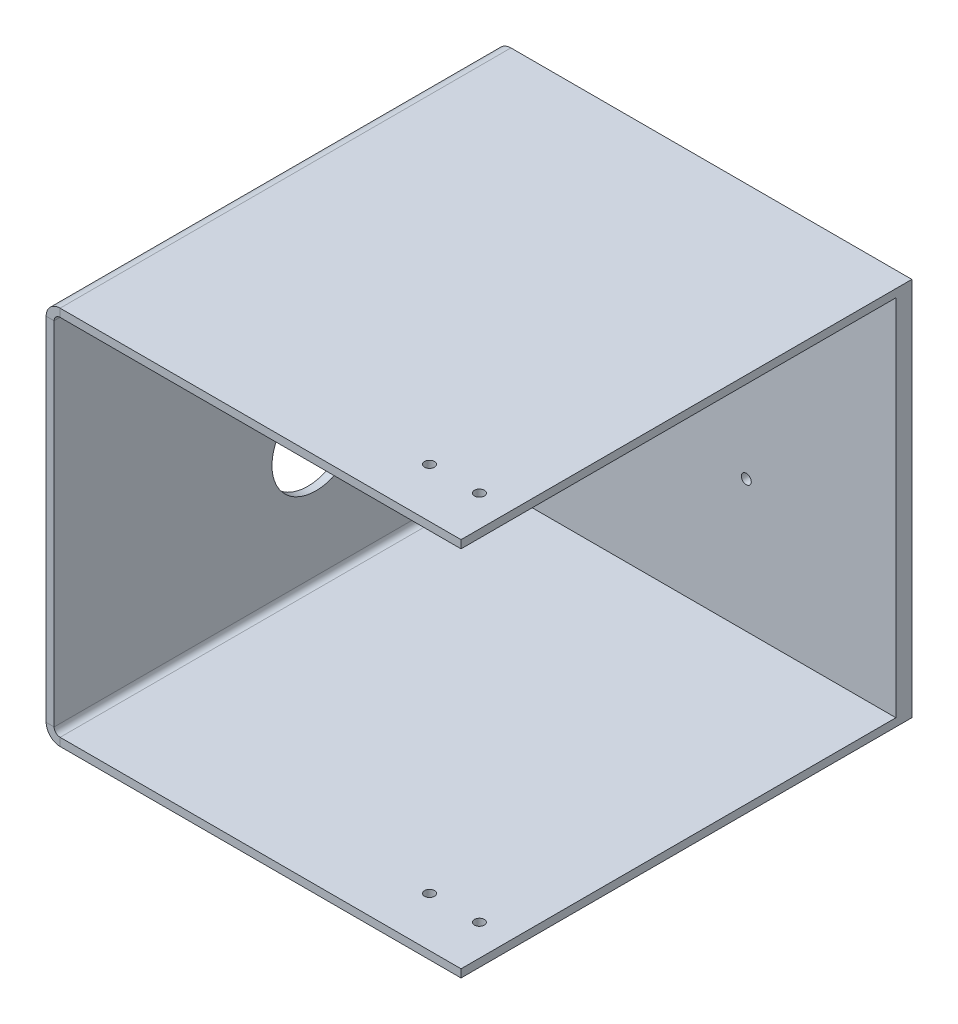
ISO-10303-21;
HEADER;
FILE_DESCRIPTION(('STEP AP214'),'2;1');
FILE_NAME('part.step','',(''),(''),'','','');
FILE_SCHEMA(('AUTOMOTIVE_DESIGN { 1 0 10303 214 1 1 1 1 }'));
ENDSEC;
DATA;
#1=APPLICATION_CONTEXT('core data for automotive mechanical design processes');
#2=APPLICATION_PROTOCOL_DEFINITION('international standard','automotive_design',2000,#1);
#3=PRODUCT_CONTEXT('',#1,'mechanical');
#4=PRODUCT('Part','Part','',(#3));
#5=PRODUCT_RELATED_PRODUCT_CATEGORY('part','',(#4));
#6=PRODUCT_DEFINITION_FORMATION('','',#4);
#7=PRODUCT_DEFINITION_CONTEXT('part definition',#1,'design');
#8=PRODUCT_DEFINITION('design','',#6,#7);
#9=PRODUCT_DEFINITION_SHAPE('','',#8);
#10=(LENGTH_UNIT() NAMED_UNIT(*) SI_UNIT(.MILLI.,.METRE.));
#11=(NAMED_UNIT(*) PLANE_ANGLE_UNIT() SI_UNIT($,.RADIAN.));
#12=(NAMED_UNIT(*) SI_UNIT($,.STERADIAN.) SOLID_ANGLE_UNIT());
#13=UNCERTAINTY_MEASURE_WITH_UNIT(LENGTH_MEASURE(1.E-05),#10,'distance_accuracy_value','');
#14=(GEOMETRIC_REPRESENTATION_CONTEXT(3) GLOBAL_UNCERTAINTY_ASSIGNED_CONTEXT((#13)) GLOBAL_UNIT_ASSIGNED_CONTEXT((#10,
#11,#12)) REPRESENTATION_CONTEXT('',''));
#15=CARTESIAN_POINT('',(0.,0.,0.));
#16=DIRECTION('',(0.,0.,1.));
#17=DIRECTION('',(1.,0.,0.));
#18=AXIS2_PLACEMENT_3D('',#15,#16,#17);
#19=CARTESIAN_POINT('',(0.,-44.08,113.));
#20=DIRECTION('',(0.,0.,1.));
#21=DIRECTION('',(1.,0.,0.));
#22=AXIS2_PLACEMENT_3D('',#19,#20,#21);
#23=PLANE('',#22);
#24=DIRECTION('',(1.,0.,0.));
#25=VECTOR('',#24,1.);
#26=CARTESIAN_POINT('',(0.,-44.08,113.));
#27=LINE('',#26,#25);
#28=CARTESIAN_POINT('',(0.,-44.08,113.));
#29=VERTEX_POINT('',#28);
#30=CARTESIAN_POINT('',(2.00000000000001,-44.08,113.));
#31=VERTEX_POINT('',#30);
#32=EDGE_CURVE('E11',#29,#31,#27,.T.);
#33=ORIENTED_EDGE('',*,*,#32,.F.);
#34=CARTESIAN_POINT('',(3.50000000000001,-44.08,113.));
#35=DIRECTION('',(0.,0.,1.));
#36=DIRECTION('',(1.,0.,0.));
#37=AXIS2_PLACEMENT_3D('',#34,#35,#36);
#38=CIRCLE('',#37,3.5);
#39=CARTESIAN_POINT('',(3.50000000000001,-47.58,113.));
#40=VERTEX_POINT('',#39);
#41=EDGE_CURVE('E184',#40,#29,#38,.F.);
#42=ORIENTED_EDGE('',*,*,#41,.F.);
#43=DIRECTION('',(0.,-1.,0.));
#44=VECTOR('',#43,1.);
#45=CARTESIAN_POINT('',(3.50000000000001,-45.58,113.));
#46=LINE('',#45,#44);
#47=CARTESIAN_POINT('',(3.50000000000001,-45.58,113.));
#48=VERTEX_POINT('',#47);
#49=EDGE_CURVE('E52',#48,#40,#46,.T.);
#50=ORIENTED_EDGE('',*,*,#49,.F.);
#51=CARTESIAN_POINT('',(3.50000000000001,-44.08,113.));
#52=DIRECTION('',(0.,0.,1.));
#53=DIRECTION('',(1.,0.,0.));
#54=AXIS2_PLACEMENT_3D('',#51,#52,#53);
#55=CIRCLE('',#54,1.5);
#56=EDGE_CURVE('E200',#48,#31,#55,.F.);
#57=ORIENTED_EDGE('',*,*,#56,.T.);
#58=EDGE_LOOP('',(#33,#42,#50,#57));
#59=FACE_BOUND('',#58,.T.);
#60=ADVANCED_FACE('F43',(#59),#23,.T.);
#61=CARTESIAN_POINT('',(3.50000000000001,-45.58,113.));
#62=DIRECTION('',(0.,0.,1.));
#63=DIRECTION('',(1.,0.,0.));
#64=AXIS2_PLACEMENT_3D('',#61,#62,#63);
#65=PLANE('',#64);
#66=DIRECTION('',(0.,1.,0.));
#67=VECTOR('',#66,1.);
#68=CARTESIAN_POINT('',(0.,47.58,113.));
#69=LINE('',#68,#67);
#70=CARTESIAN_POINT('',(0.,44.08,113.));
#71=VERTEX_POINT('',#70);
#72=EDGE_CURVE('E180',#29,#71,#69,.T.);
#73=ORIENTED_EDGE('',*,*,#72,.F.);
#74=ORIENTED_EDGE('',*,*,#32,.T.);
#75=DIRECTION('',(0.,1.,0.));
#76=VECTOR('',#75,1.);
#77=CARTESIAN_POINT('',(1.99999999999998,47.58,113.));
#78=LINE('',#77,#76);
#79=CARTESIAN_POINT('',(1.99999999999998,44.08,113.));
#80=VERTEX_POINT('',#79);
#81=EDGE_CURVE('E204',#31,#80,#78,.T.);
#82=ORIENTED_EDGE('',*,*,#81,.T.);
#83=DIRECTION('',(-1.,0.,0.));
#84=VECTOR('',#83,1.);
#85=CARTESIAN_POINT('',(1.99999999999998,44.08,113.));
#86=LINE('',#85,#84);
#87=EDGE_CURVE('E278',#80,#71,#86,.T.);
#88=ORIENTED_EDGE('',*,*,#87,.T.);
#89=EDGE_LOOP('',(#73,#74,#82,#88));
#90=FACE_BOUND('',#89,.T.);
#91=ADVANCED_FACE('F362',(#90),#65,.T.);
#92=CARTESIAN_POINT('',(3.49999999999998,47.58,113.));
#93=DIRECTION('',(0.,0.,1.));
#94=DIRECTION('',(1.,0.,0.));
#95=AXIS2_PLACEMENT_3D('',#92,#93,#94);
#96=PLANE('',#95);
#97=DIRECTION('',(0.,-1.,0.));
#98=VECTOR('',#97,1.);
#99=CARTESIAN_POINT('',(3.49999999999998,47.58,113.));
#100=LINE('',#99,#98);
#101=CARTESIAN_POINT('',(3.49999999999998,47.58,113.));
#102=VERTEX_POINT('',#101);
#103=CARTESIAN_POINT('',(3.49999999999998,45.58,113.));
#104=VERTEX_POINT('',#103);
#105=EDGE_CURVE('E153',#102,#104,#100,.T.);
#106=ORIENTED_EDGE('',*,*,#105,.F.);
#107=CARTESIAN_POINT('',(3.49999999999998,44.08,113.));
#108=DIRECTION('',(0.,0.,1.));
#109=DIRECTION('',(1.,0.,0.));
#110=AXIS2_PLACEMENT_3D('',#107,#108,#109);
#111=CIRCLE('',#110,3.5);
#112=EDGE_CURVE('E173',#71,#102,#111,.F.);
#113=ORIENTED_EDGE('',*,*,#112,.F.);
#114=ORIENTED_EDGE('',*,*,#87,.F.);
#115=CARTESIAN_POINT('',(3.49999999999998,44.08,113.));
#116=DIRECTION('',(0.,0.,1.));
#117=DIRECTION('',(1.,0.,0.));
#118=AXIS2_PLACEMENT_3D('',#115,#116,#117);
#119=CIRCLE('',#118,1.5);
#120=EDGE_CURVE('E208',#80,#104,#119,.F.);
#121=ORIENTED_EDGE('',*,*,#120,.T.);
#122=EDGE_LOOP('',(#106,#113,#114,#121));
#123=FACE_BOUND('',#122,.T.);
#124=ADVANCED_FACE('F355',(#123),#96,.T.);
#125=CARTESIAN_POINT('',(1.99999999999998,44.08,113.));
#126=DIRECTION('',(0.,0.,1.));
#127=DIRECTION('',(1.,0.,0.));
#128=AXIS2_PLACEMENT_3D('',#125,#126,#127);
#129=PLANE('',#128);
#130=DIRECTION('',(1.,0.,0.));
#131=VECTOR('',#130,1.);
#132=CARTESIAN_POINT('',(0.,47.58,113.));
#133=LINE('',#132,#131);
#134=CARTESIAN_POINT('',(104.,47.58,113.));
#135=VERTEX_POINT('',#134);
#136=EDGE_CURVE('E170',#102,#135,#133,.T.);
#137=ORIENTED_EDGE('',*,*,#136,.F.);
#138=ORIENTED_EDGE('',*,*,#105,.T.);
#139=DIRECTION('',(1.,0.,0.));
#140=VECTOR('',#139,1.);
#141=CARTESIAN_POINT('',(0.,45.58,113.));
#142=LINE('',#141,#140);
#143=CARTESIAN_POINT('',(104.,45.58,113.));
#144=VERTEX_POINT('',#143);
#145=EDGE_CURVE('E147',#104,#144,#142,.T.);
#146=ORIENTED_EDGE('',*,*,#145,.T.);
#147=DIRECTION('',(0.,-1.,0.));
#148=VECTOR('',#147,1.);
#149=CARTESIAN_POINT('',(104.,47.58,113.));
#150=LINE('',#149,#148);
#151=EDGE_CURVE('E151',#135,#144,#150,.T.);
#152=ORIENTED_EDGE('',*,*,#151,.F.);
#153=EDGE_LOOP('',(#137,#138,#146,#152));
#154=FACE_BOUND('',#153,.T.);
#155=ADVANCED_FACE('F149',(#154),#129,.T.);
#156=CARTESIAN_POINT('',(0.,45.58,113.));
#157=DIRECTION('',(0.,1.,0.));
#158=DIRECTION('',(0.,0.,1.));
#159=AXIS2_PLACEMENT_3D('',#156,#157,#158);
#160=PLANE('',#159);
#161=CARTESIAN_POINT('',(83.7,45.58,100.6));
#162=DIRECTION('',(0.,1.,0.));
#163=DIRECTION('',(0.,0.,1.));
#164=AXIS2_PLACEMENT_3D('',#161,#162,#163);
#165=CIRCLE('',#164,1.24999999999998);
#166=CARTESIAN_POINT('',(83.7,45.58,101.85));
#167=VERTEX_POINT('',#166);
#168=EDGE_CURVE('E309',#167,#167,#165,.T.);
#169=ORIENTED_EDGE('',*,*,#168,.T.);
#170=EDGE_LOOP('',(#169));
#171=FACE_BOUND('',#170,.T.);
#172=CARTESIAN_POINT('',(96.2,45.58,100.6));
#173=DIRECTION('',(0.,1.,0.));
#174=DIRECTION('',(0.,0.,1.));
#175=AXIS2_PLACEMENT_3D('',#172,#173,#174);
#176=CIRCLE('',#175,1.24999999999998);
#177=CARTESIAN_POINT('',(96.2,45.58,101.85));
#178=VERTEX_POINT('',#177);
#179=EDGE_CURVE('E293',#178,#178,#176,.T.);
#180=ORIENTED_EDGE('',*,*,#179,.T.);
#181=EDGE_LOOP('',(#180));
#182=FACE_BOUND('',#181,.T.);
#183=DIRECTION('',(0.,0.,-1.));
#184=VECTOR('',#183,1.);
#185=CARTESIAN_POINT('',(3.49999999999998,45.58,113.));
#186=LINE('',#185,#184);
#187=CARTESIAN_POINT('',(3.49999999999998,45.58,4.));
#188=VERTEX_POINT('',#187);
#189=EDGE_CURVE('E211',#104,#188,#186,.T.);
#190=ORIENTED_EDGE('',*,*,#189,.T.);
#191=DIRECTION('',(-1.,0.,0.));
#192=VECTOR('',#191,1.);
#193=CARTESIAN_POINT('',(104.,45.58,4.));
#194=LINE('',#193,#192);
#195=CARTESIAN_POINT('',(104.,45.58,4.));
#196=VERTEX_POINT('',#195);
#197=EDGE_CURVE('E60',#196,#188,#194,.T.);
#198=ORIENTED_EDGE('',*,*,#197,.F.);
#199=DIRECTION('',(0.,0.,-1.));
#200=VECTOR('',#199,1.);
#201=CARTESIAN_POINT('',(104.,45.58,113.));
#202=LINE('',#201,#200);
#203=EDGE_CURVE('E158',#144,#196,#202,.T.);
#204=ORIENTED_EDGE('',*,*,#203,.F.);
#205=ORIENTED_EDGE('',*,*,#145,.F.);
#206=EDGE_LOOP('',(#190,#198,#204,#205));
#207=FACE_BOUND('',#206,.T.);
#208=ADVANCED_FACE('F159',(#171,#182,#207),#160,.F.);
#209=CARTESIAN_POINT('',(0.,47.58,113.));
#210=DIRECTION('',(0.,1.,0.));
#211=DIRECTION('',(0.,0.,1.));
#212=AXIS2_PLACEMENT_3D('',#209,#210,#211);
#213=PLANE('',#212);
#214=CARTESIAN_POINT('',(83.7,47.58,100.6));
#215=DIRECTION('',(0.,-1.,0.));
#216=DIRECTION('',(0.,0.,-1.));
#217=AXIS2_PLACEMENT_3D('',#214,#215,#216);
#218=CIRCLE('',#217,1.24999999999997);
#219=CARTESIAN_POINT('',(83.7,47.58,99.35));
#220=VERTEX_POINT('',#219);
#221=EDGE_CURVE('E708',#220,#220,#218,.T.);
#222=ORIENTED_EDGE('',*,*,#221,.T.);
#223=EDGE_LOOP('',(#222));
#224=FACE_BOUND('',#223,.T.);
#225=CARTESIAN_POINT('',(96.2,47.58,100.6));
#226=DIRECTION('',(0.,-1.,0.));
#227=DIRECTION('',(0.,0.,-1.));
#228=AXIS2_PLACEMENT_3D('',#225,#226,#227);
#229=CIRCLE('',#228,1.24999999999997);
#230=CARTESIAN_POINT('',(96.2,47.58,99.35));
#231=VERTEX_POINT('',#230);
#232=EDGE_CURVE('E294',#231,#231,#229,.T.);
#233=ORIENTED_EDGE('',*,*,#232,.T.);
#234=EDGE_LOOP('',(#233));
#235=FACE_BOUND('',#234,.T.);
#236=DIRECTION('',(1.,0.,0.));
#237=VECTOR('',#236,1.);
#238=CARTESIAN_POINT('',(0.,47.58,0.));
#239=LINE('',#238,#237);
#240=CARTESIAN_POINT('',(3.49999999999998,47.58,0.));
#241=VERTEX_POINT('',#240);
#242=CARTESIAN_POINT('',(104.,47.58,0.));
#243=VERTEX_POINT('',#242);
#244=EDGE_CURVE('E212',#241,#243,#239,.T.);
#245=ORIENTED_EDGE('',*,*,#244,.F.);
#246=DIRECTION('',(0.,0.,-1.));
#247=VECTOR('',#246,1.);
#248=CARTESIAN_POINT('',(3.49999999999998,47.58,113.));
#249=LINE('',#248,#247);
#250=EDGE_CURVE('E267',#102,#241,#249,.T.);
#251=ORIENTED_EDGE('',*,*,#250,.F.);
#252=ORIENTED_EDGE('',*,*,#136,.T.);
#253=DIRECTION('',(0.,0.,-1.));
#254=VECTOR('',#253,1.);
#255=CARTESIAN_POINT('',(104.,47.58,113.));
#256=LINE('',#255,#254);
#257=EDGE_CURVE('E165',#135,#243,#256,.T.);
#258=ORIENTED_EDGE('',*,*,#257,.T.);
#259=EDGE_LOOP('',(#245,#251,#252,#258));
#260=FACE_BOUND('',#259,.T.);
#261=ADVANCED_FACE('F346',(#224,#235,#260),#213,.T.);
#262=CARTESIAN_POINT('',(3.49999999999998,44.08,113.));
#263=DIRECTION('',(0.,0.,-1.));
#264=DIRECTION('',(-1.,0.,0.));
#265=AXIS2_PLACEMENT_3D('',#262,#263,#264);
#266=CYLINDRICAL_SURFACE('',#265,3.5);
#267=CARTESIAN_POINT('',(3.49999999999998,44.08,0.));
#268=DIRECTION('',(0.,0.,1.));
#269=DIRECTION('',(1.,0.,0.));
#270=AXIS2_PLACEMENT_3D('',#267,#268,#269);
#271=CIRCLE('',#270,3.5);
#272=CARTESIAN_POINT('',(0.,44.08,0.));
#273=VERTEX_POINT('',#272);
#274=EDGE_CURVE('E216',#273,#241,#271,.F.);
#275=ORIENTED_EDGE('',*,*,#274,.F.);
#276=DIRECTION('',(0.,0.,-1.));
#277=VECTOR('',#276,1.);
#278=CARTESIAN_POINT('',(0.,44.08,113.));
#279=LINE('',#278,#277);
#280=EDGE_CURVE('E263',#71,#273,#279,.T.);
#281=ORIENTED_EDGE('',*,*,#280,.F.);
#282=ORIENTED_EDGE('',*,*,#112,.T.);
#283=ORIENTED_EDGE('',*,*,#250,.T.);
#284=EDGE_LOOP('',(#275,#281,#282,#283));
#285=FACE_BOUND('',#284,.T.);
#286=ADVANCED_FACE('F351',(#285),#266,.T.);
#287=CARTESIAN_POINT('',(0.,47.58,113.));
#288=DIRECTION('',(-1.,0.,0.));
#289=DIRECTION('',(0.,-1.,0.));
#290=AXIS2_PLACEMENT_3D('',#287,#288,#289);
#291=PLANE('',#290);
#292=CARTESIAN_POINT('',(0.,-14.64,47.4));
#293=DIRECTION('',(-1.,0.,0.));
#294=DIRECTION('',(0.,-1.,0.));
#295=AXIS2_PLACEMENT_3D('',#292,#293,#294);
#296=CIRCLE('',#295,11.);
#297=CARTESIAN_POINT('',(0.,-25.64,47.4));
#298=VERTEX_POINT('',#297);
#299=EDGE_CURVE('E722',#298,#298,#296,.T.);
#300=ORIENTED_EDGE('',*,*,#299,.F.);
#301=EDGE_LOOP('',(#300));
#302=FACE_BOUND('',#301,.T.);
#303=DIRECTION('',(0.,1.,0.));
#304=VECTOR('',#303,1.);
#305=CARTESIAN_POINT('',(0.,47.58,0.));
#306=LINE('',#305,#304);
#307=CARTESIAN_POINT('',(0.,-44.08,0.));
#308=VERTEX_POINT('',#307);
#309=EDGE_CURVE('E221',#308,#273,#306,.T.);
#310=ORIENTED_EDGE('',*,*,#309,.F.);
#311=DIRECTION('',(0.,0.,-1.));
#312=VECTOR('',#311,1.);
#313=CARTESIAN_POINT('',(0.,-44.08,113.));
#314=LINE('',#313,#312);
#315=EDGE_CURVE('E259',#29,#308,#314,.T.);
#316=ORIENTED_EDGE('',*,*,#315,.F.);
#317=ORIENTED_EDGE('',*,*,#72,.T.);
#318=ORIENTED_EDGE('',*,*,#280,.T.);
#319=EDGE_LOOP('',(#310,#316,#317,#318));
#320=FACE_BOUND('',#319,.T.);
#321=ADVANCED_FACE('F360',(#302,#320),#291,.T.);
#322=CARTESIAN_POINT('',(3.50000000000001,-44.08,113.));
#323=DIRECTION('',(0.,0.,-1.));
#324=DIRECTION('',(-1.,0.,0.));
#325=AXIS2_PLACEMENT_3D('',#322,#323,#324);
#326=CYLINDRICAL_SURFACE('',#325,3.5);
#327=CARTESIAN_POINT('',(3.50000000000001,-44.08,0.));
#328=DIRECTION('',(0.,0.,1.));
#329=DIRECTION('',(1.,0.,0.));
#330=AXIS2_PLACEMENT_3D('',#327,#328,#329);
#331=CIRCLE('',#330,3.5);
#332=CARTESIAN_POINT('',(3.50000000000001,-47.58,0.));
#333=VERTEX_POINT('',#332);
#334=EDGE_CURVE('E225',#333,#308,#331,.F.);
#335=ORIENTED_EDGE('',*,*,#334,.F.);
#336=DIRECTION('',(0.,0.,-1.));
#337=VECTOR('',#336,1.);
#338=CARTESIAN_POINT('',(3.50000000000001,-47.58,113.));
#339=LINE('',#338,#337);
#340=EDGE_CURVE('E255',#40,#333,#339,.T.);
#341=ORIENTED_EDGE('',*,*,#340,.F.);
#342=ORIENTED_EDGE('',*,*,#41,.T.);
#343=ORIENTED_EDGE('',*,*,#315,.T.);
#344=EDGE_LOOP('',(#335,#341,#342,#343));
#345=FACE_BOUND('',#344,.T.);
#346=ADVANCED_FACE('F365',(#345),#326,.T.);
#347=CARTESIAN_POINT('',(0.,-47.58,113.));
#348=DIRECTION('',(0.,-1.,0.));
#349=DIRECTION('',(0.,0.,-1.));
#350=AXIS2_PLACEMENT_3D('',#347,#348,#349);
#351=PLANE('',#350);
#352=CARTESIAN_POINT('',(83.7,-47.58,100.6));
#353=DIRECTION('',(0.,-1.,0.));
#354=DIRECTION('',(0.,0.,-1.));
#355=AXIS2_PLACEMENT_3D('',#352,#353,#354);
#356=CIRCLE('',#355,1.24999999999999);
#357=CARTESIAN_POINT('',(83.7,-47.58,99.35));
#358=VERTEX_POINT('',#357);
#359=EDGE_CURVE('E717',#358,#358,#356,.T.);
#360=ORIENTED_EDGE('',*,*,#359,.F.);
#361=EDGE_LOOP('',(#360));
#362=FACE_BOUND('',#361,.T.);
#363=CARTESIAN_POINT('',(96.2,-47.58,100.6));
#364=DIRECTION('',(0.,-1.,0.));
#365=DIRECTION('',(0.,0.,-1.));
#366=AXIS2_PLACEMENT_3D('',#363,#364,#365);
#367=CIRCLE('',#366,1.24999999999999);
#368=CARTESIAN_POINT('',(96.2,-47.58,99.35));
#369=VERTEX_POINT('',#368);
#370=EDGE_CURVE('E303',#369,#369,#367,.T.);
#371=ORIENTED_EDGE('',*,*,#370,.F.);
#372=EDGE_LOOP('',(#371));
#373=FACE_BOUND('',#372,.T.);
#374=DIRECTION('',(-1.,0.,0.));
#375=VECTOR('',#374,1.);
#376=CARTESIAN_POINT('',(0.,-47.58,0.));
#377=LINE('',#376,#375);
#378=CARTESIAN_POINT('',(104.,-47.58,0.));
#379=VERTEX_POINT('',#378);
#380=EDGE_CURVE('E229',#379,#333,#377,.T.);
#381=ORIENTED_EDGE('',*,*,#380,.F.);
#382=DIRECTION('',(0.,0.,-1.));
#383=VECTOR('',#382,1.);
#384=CARTESIAN_POINT('',(104.,-47.58,113.));
#385=LINE('',#384,#383);
#386=CARTESIAN_POINT('',(104.,-47.58,113.));
#387=VERTEX_POINT('',#386);
#388=EDGE_CURVE('E252',#387,#379,#385,.T.);
#389=ORIENTED_EDGE('',*,*,#388,.F.);
#390=DIRECTION('',(-1.,0.,0.));
#391=VECTOR('',#390,1.);
#392=CARTESIAN_POINT('',(0.,-47.58,113.));
#393=LINE('',#392,#391);
#394=EDGE_CURVE('E188',#387,#40,#393,.T.);
#395=ORIENTED_EDGE('',*,*,#394,.T.);
#396=ORIENTED_EDGE('',*,*,#340,.T.);
#397=EDGE_LOOP('',(#381,#389,#395,#396));
#398=FACE_BOUND('',#397,.T.);
#399=ADVANCED_FACE('F341',(#362,#373,#398),#351,.T.);
#400=CARTESIAN_POINT('',(104.,-45.58,113.));
#401=DIRECTION('',(1.,0.,0.));
#402=DIRECTION('',(0.,0.,-1.));
#403=AXIS2_PLACEMENT_3D('',#400,#401,#402);
#404=PLANE('',#403);
#405=DIRECTION('',(0.,-1.,0.));
#406=VECTOR('',#405,1.);
#407=CARTESIAN_POINT('',(104.,-45.58,0.));
#408=LINE('',#407,#406);
#409=EDGE_CURVE('E156',#243,#379,#408,.T.);
#410=ORIENTED_EDGE('',*,*,#409,.F.);
#411=ORIENTED_EDGE('',*,*,#257,.F.);
#412=ORIENTED_EDGE('',*,*,#151,.T.);
#413=ORIENTED_EDGE('',*,*,#203,.T.);
#414=DIRECTION('',(0.,1.,0.));
#415=VECTOR('',#414,1.);
#416=CARTESIAN_POINT('',(104.,-45.58,4.));
#417=LINE('',#416,#415);
#418=CARTESIAN_POINT('',(104.,-45.58,4.));
#419=VERTEX_POINT('',#418);
#420=EDGE_CURVE('E300',#419,#196,#417,.T.);
#421=ORIENTED_EDGE('',*,*,#420,.F.);
#422=DIRECTION('',(0.,0.,-1.));
#423=VECTOR('',#422,1.);
#424=CARTESIAN_POINT('',(104.,-45.58,113.));
#425=LINE('',#424,#423);
#426=CARTESIAN_POINT('',(104.,-45.58,113.));
#427=VERTEX_POINT('',#426);
#428=EDGE_CURVE('E68',#427,#419,#425,.T.);
#429=ORIENTED_EDGE('',*,*,#428,.F.);
#430=DIRECTION('',(0.,-1.,0.));
#431=VECTOR('',#430,1.);
#432=CARTESIAN_POINT('',(104.,-45.58,113.));
#433=LINE('',#432,#431);
#434=EDGE_CURVE('E192',#427,#387,#433,.T.);
#435=ORIENTED_EDGE('',*,*,#434,.T.);
#436=ORIENTED_EDGE('',*,*,#388,.T.);
#437=EDGE_LOOP('',(#410,#411,#412,#413,#421,#429,#435,#436));
#438=FACE_BOUND('',#437,.T.);
#439=ADVANCED_FACE('F167',(#438),#404,.T.);
#440=CARTESIAN_POINT('',(0.,-45.58,113.));
#441=DIRECTION('',(0.,-1.,0.));
#442=DIRECTION('',(0.,0.,-1.));
#443=AXIS2_PLACEMENT_3D('',#440,#441,#442);
#444=PLANE('',#443);
#445=CARTESIAN_POINT('',(83.7,-45.58,100.6));
#446=DIRECTION('',(0.,-1.,0.));
#447=DIRECTION('',(0.,0.,-1.));
#448=AXIS2_PLACEMENT_3D('',#445,#446,#447);
#449=CIRCLE('',#448,1.24999999999998);
#450=CARTESIAN_POINT('',(83.7,-45.58,99.35));
#451=VERTEX_POINT('',#450);
#452=EDGE_CURVE('E46',#451,#451,#449,.T.);
#453=ORIENTED_EDGE('',*,*,#452,.T.);
#454=EDGE_LOOP('',(#453));
#455=FACE_BOUND('',#454,.T.);
#456=CARTESIAN_POINT('',(96.2,-45.58,100.6));
#457=DIRECTION('',(0.,-1.,0.));
#458=DIRECTION('',(0.,0.,-1.));
#459=AXIS2_PLACEMENT_3D('',#456,#457,#458);
#460=CIRCLE('',#459,1.24999999999998);
#461=CARTESIAN_POINT('',(96.2,-45.58,99.35));
#462=VERTEX_POINT('',#461);
#463=EDGE_CURVE('E290',#462,#462,#460,.T.);
#464=ORIENTED_EDGE('',*,*,#463,.T.);
#465=EDGE_LOOP('',(#464));
#466=FACE_BOUND('',#465,.T.);
#467=ORIENTED_EDGE('',*,*,#428,.T.);
#468=DIRECTION('',(1.,0.,0.));
#469=VECTOR('',#468,1.);
#470=CARTESIAN_POINT('',(3.50000000000001,-45.58,4.));
#471=LINE('',#470,#469);
#472=CARTESIAN_POINT('',(3.50000000000001,-45.58,4.));
#473=VERTEX_POINT('',#472);
#474=EDGE_CURVE('E217',#473,#419,#471,.T.);
#475=ORIENTED_EDGE('',*,*,#474,.F.);
#476=DIRECTION('',(0.,0.,-1.));
#477=VECTOR('',#476,1.);
#478=CARTESIAN_POINT('',(3.50000000000001,-45.58,113.));
#479=LINE('',#478,#477);
#480=EDGE_CURVE('E246',#48,#473,#479,.T.);
#481=ORIENTED_EDGE('',*,*,#480,.F.);
#482=DIRECTION('',(1.,0.,0.));
#483=VECTOR('',#482,1.);
#484=CARTESIAN_POINT('',(0.,-45.58,113.));
#485=LINE('',#484,#483);
#486=EDGE_CURVE('E196',#427,#48,#485,.F.);
#487=ORIENTED_EDGE('',*,*,#486,.F.);
#488=EDGE_LOOP('',(#467,#475,#481,#487));
#489=FACE_BOUND('',#488,.T.);
#490=ADVANCED_FACE('F333',(#455,#466,#489),#444,.F.);
#491=CARTESIAN_POINT('',(3.50000000000001,-44.08,113.));
#492=DIRECTION('',(0.,0.,-1.));
#493=DIRECTION('',(-1.,0.,0.));
#494=AXIS2_PLACEMENT_3D('',#491,#492,#493);
#495=CYLINDRICAL_SURFACE('',#494,1.5);
#496=ORIENTED_EDGE('',*,*,#480,.T.);
#497=CARTESIAN_POINT('',(3.50000000000001,-44.08,4.));
#498=DIRECTION('',(0.,0.,1.));
#499=DIRECTION('',(1.,0.,0.));
#500=AXIS2_PLACEMENT_3D('',#497,#498,#499);
#501=CIRCLE('',#500,1.50000000000001);
#502=CARTESIAN_POINT('',(2.00000000000001,-44.08,4.));
#503=VERTEX_POINT('',#502);
#504=EDGE_CURVE('E325',#503,#473,#501,.T.);
#505=ORIENTED_EDGE('',*,*,#504,.F.);
#506=DIRECTION('',(0.,0.,-1.));
#507=VECTOR('',#506,1.);
#508=CARTESIAN_POINT('',(2.00000000000001,-44.08,113.));
#509=LINE('',#508,#507);
#510=EDGE_CURVE('E242',#31,#503,#509,.T.);
#511=ORIENTED_EDGE('',*,*,#510,.F.);
#512=ORIENTED_EDGE('',*,*,#56,.F.);
#513=EDGE_LOOP('',(#496,#505,#511,#512));
#514=FACE_BOUND('',#513,.T.);
#515=ADVANCED_FACE('F370',(#514),#495,.F.);
#516=CARTESIAN_POINT('',(1.99999999999998,47.58,113.));
#517=DIRECTION('',(-1.,0.,0.));
#518=DIRECTION('',(0.,-1.,0.));
#519=AXIS2_PLACEMENT_3D('',#516,#517,#518);
#520=PLANE('',#519);
#521=CARTESIAN_POINT('',(2.,-14.64,47.4));
#522=DIRECTION('',(-1.,0.,0.));
#523=DIRECTION('',(0.,-1.,0.));
#524=AXIS2_PLACEMENT_3D('',#521,#522,#523);
#525=CIRCLE('',#524,11.);
#526=CARTESIAN_POINT('',(2.00000000000001,-25.64,47.4));
#527=VERTEX_POINT('',#526);
#528=EDGE_CURVE('E721',#527,#527,#525,.T.);
#529=ORIENTED_EDGE('',*,*,#528,.T.);
#530=EDGE_LOOP('',(#529));
#531=FACE_BOUND('',#530,.T.);
#532=ORIENTED_EDGE('',*,*,#510,.T.);
#533=DIRECTION('',(0.,-1.,0.));
#534=VECTOR('',#533,1.);
#535=CARTESIAN_POINT('',(1.99999999999998,44.08,4.));
#536=LINE('',#535,#534);
#537=CARTESIAN_POINT('',(1.99999999999998,44.08,4.));
#538=VERTEX_POINT('',#537);
#539=EDGE_CURVE('E321',#538,#503,#536,.T.);
#540=ORIENTED_EDGE('',*,*,#539,.F.);
#541=DIRECTION('',(0.,0.,-1.));
#542=VECTOR('',#541,1.);
#543=CARTESIAN_POINT('',(1.99999999999998,44.08,113.));
#544=LINE('',#543,#542);
#545=EDGE_CURVE('E238',#80,#538,#544,.T.);
#546=ORIENTED_EDGE('',*,*,#545,.F.);
#547=ORIENTED_EDGE('',*,*,#81,.F.);
#548=EDGE_LOOP('',(#532,#540,#546,#547));
#549=FACE_BOUND('',#548,.T.);
#550=ADVANCED_FACE('F373',(#531,#549),#520,.F.);
#551=CARTESIAN_POINT('',(3.49999999999998,44.08,113.));
#552=DIRECTION('',(0.,0.,-1.));
#553=DIRECTION('',(-1.,0.,0.));
#554=AXIS2_PLACEMENT_3D('',#551,#552,#553);
#555=CYLINDRICAL_SURFACE('',#554,1.5);
#556=ORIENTED_EDGE('',*,*,#545,.T.);
#557=CARTESIAN_POINT('',(3.49999999999998,44.08,4.));
#558=DIRECTION('',(0.,0.,1.));
#559=DIRECTION('',(1.,0.,0.));
#560=AXIS2_PLACEMENT_3D('',#557,#558,#559);
#561=CIRCLE('',#560,1.5);
#562=EDGE_CURVE('E317',#188,#538,#561,.T.);
#563=ORIENTED_EDGE('',*,*,#562,.F.);
#564=ORIENTED_EDGE('',*,*,#189,.F.);
#565=ORIENTED_EDGE('',*,*,#120,.F.);
#566=EDGE_LOOP('',(#556,#563,#564,#565));
#567=FACE_BOUND('',#566,.T.);
#568=ADVANCED_FACE('F377',(#567),#555,.F.);
#569=CARTESIAN_POINT('',(3.49999999999998,44.08,113.));
#570=DIRECTION('',(0.,0.,1.));
#571=DIRECTION('',(1.,0.,0.));
#572=AXIS2_PLACEMENT_3D('',#569,#570,#571);
#573=PLANE('',#572);
#574=ORIENTED_EDGE('',*,*,#486,.T.);
#575=ORIENTED_EDGE('',*,*,#49,.T.);
#576=ORIENTED_EDGE('',*,*,#394,.F.);
#577=ORIENTED_EDGE('',*,*,#434,.F.);
#578=EDGE_LOOP('',(#574,#575,#576,#577));
#579=FACE_BOUND('',#578,.T.);
#580=ADVANCED_FACE('F337',(#579),#573,.T.);
#581=CARTESIAN_POINT('',(3.49999999999998,44.08,0.));
#582=DIRECTION('',(0.,0.,1.));
#583=DIRECTION('',(1.,0.,0.));
#584=AXIS2_PLACEMENT_3D('',#581,#582,#583);
#585=PLANE('',#584);
#586=CARTESIAN_POINT('',(41.5,12.5,0.));
#587=DIRECTION('',(0.,0.,1.));
#588=DIRECTION('',(1.,0.,0.));
#589=AXIS2_PLACEMENT_3D('',#586,#587,#588);
#590=CIRCLE('',#589,1.25);
#591=CARTESIAN_POINT('',(42.75,12.5,0.));
#592=VERTEX_POINT('',#591);
#593=EDGE_CURVE('E753',#592,#592,#590,.T.);
#594=ORIENTED_EDGE('',*,*,#593,.T.);
#595=EDGE_LOOP('',(#594));
#596=FACE_BOUND('',#595,.T.);
#597=CARTESIAN_POINT('',(66.5,12.5,0.));
#598=DIRECTION('',(0.,0.,1.));
#599=DIRECTION('',(1.,0.,0.));
#600=AXIS2_PLACEMENT_3D('',#597,#598,#599);
#601=CIRCLE('',#600,1.25);
#602=CARTESIAN_POINT('',(67.75,12.5,0.));
#603=VERTEX_POINT('',#602);
#604=EDGE_CURVE('E745',#603,#603,#601,.T.);
#605=ORIENTED_EDGE('',*,*,#604,.T.);
#606=EDGE_LOOP('',(#605));
#607=FACE_BOUND('',#606,.T.);
#608=CARTESIAN_POINT('',(66.5,-12.5,0.));
#609=DIRECTION('',(0.,0.,1.));
#610=DIRECTION('',(1.,0.,0.));
#611=AXIS2_PLACEMENT_3D('',#608,#609,#610);
#612=CIRCLE('',#611,1.25);
#613=CARTESIAN_POINT('',(67.75,-12.5,0.));
#614=VERTEX_POINT('',#613);
#615=EDGE_CURVE('E737',#614,#614,#612,.T.);
#616=ORIENTED_EDGE('',*,*,#615,.T.);
#617=EDGE_LOOP('',(#616));
#618=FACE_BOUND('',#617,.T.);
#619=CARTESIAN_POINT('',(41.5,-12.5,0.));
#620=DIRECTION('',(0.,0.,1.));
#621=DIRECTION('',(1.,0.,0.));
#622=AXIS2_PLACEMENT_3D('',#619,#620,#621);
#623=CIRCLE('',#622,1.25);
#624=CARTESIAN_POINT('',(42.75,-12.5,0.));
#625=VERTEX_POINT('',#624);
#626=EDGE_CURVE('E726',#625,#625,#623,.T.);
#627=ORIENTED_EDGE('',*,*,#626,.T.);
#628=EDGE_LOOP('',(#627));
#629=FACE_BOUND('',#628,.T.);
#630=ORIENTED_EDGE('',*,*,#244,.T.);
#631=ORIENTED_EDGE('',*,*,#409,.T.);
#632=ORIENTED_EDGE('',*,*,#380,.T.);
#633=ORIENTED_EDGE('',*,*,#334,.T.);
#634=ORIENTED_EDGE('',*,*,#309,.T.);
#635=ORIENTED_EDGE('',*,*,#274,.T.);
#636=EDGE_LOOP('',(#630,#631,#632,#633,#634,#635));
#637=FACE_BOUND('',#636,.T.);
#638=ADVANCED_FACE('F348',(#596,#607,#618,#629,#637),#585,.F.);
#639=CARTESIAN_POINT('',(3.49999999999998,44.08,4.));
#640=DIRECTION('',(0.,0.,1.));
#641=DIRECTION('',(1.,0.,0.));
#642=AXIS2_PLACEMENT_3D('',#639,#640,#641);
#643=PLANE('',#642);
#644=CARTESIAN_POINT('',(41.5,12.5,4.));
#645=DIRECTION('',(0.,0.,1.));
#646=DIRECTION('',(1.,0.,0.));
#647=AXIS2_PLACEMENT_3D('',#644,#645,#646);
#648=CIRCLE('',#647,1.24999999999999);
#649=CARTESIAN_POINT('',(42.75,12.5,4.));
#650=VERTEX_POINT('',#649);
#651=EDGE_CURVE('E757',#650,#650,#648,.T.);
#652=ORIENTED_EDGE('',*,*,#651,.F.);
#653=EDGE_LOOP('',(#652));
#654=FACE_BOUND('',#653,.T.);
#655=CARTESIAN_POINT('',(66.5,12.5,4.));
#656=DIRECTION('',(0.,0.,1.));
#657=DIRECTION('',(1.,0.,0.));
#658=AXIS2_PLACEMENT_3D('',#655,#656,#657);
#659=CIRCLE('',#658,1.24999999999999);
#660=CARTESIAN_POINT('',(67.75,12.5,4.));
#661=VERTEX_POINT('',#660);
#662=EDGE_CURVE('E749',#661,#661,#659,.T.);
#663=ORIENTED_EDGE('',*,*,#662,.F.);
#664=EDGE_LOOP('',(#663));
#665=FACE_BOUND('',#664,.T.);
#666=CARTESIAN_POINT('',(66.5,-12.5,4.));
#667=DIRECTION('',(0.,0.,1.));
#668=DIRECTION('',(1.,0.,0.));
#669=AXIS2_PLACEMENT_3D('',#666,#667,#668);
#670=CIRCLE('',#669,1.24999999999999);
#671=CARTESIAN_POINT('',(67.75,-12.5,4.));
#672=VERTEX_POINT('',#671);
#673=EDGE_CURVE('E741',#672,#672,#670,.T.);
#674=ORIENTED_EDGE('',*,*,#673,.F.);
#675=EDGE_LOOP('',(#674));
#676=FACE_BOUND('',#675,.T.);
#677=CARTESIAN_POINT('',(41.5,-12.5,4.));
#678=DIRECTION('',(0.,0.,1.));
#679=DIRECTION('',(1.,0.,0.));
#680=AXIS2_PLACEMENT_3D('',#677,#678,#679);
#681=CIRCLE('',#680,1.24999999999999);
#682=CARTESIAN_POINT('',(42.75,-12.5,4.));
#683=VERTEX_POINT('',#682);
#684=EDGE_CURVE('E733',#683,#683,#681,.T.);
#685=ORIENTED_EDGE('',*,*,#684,.F.);
#686=EDGE_LOOP('',(#685));
#687=FACE_BOUND('',#686,.T.);
#688=ORIENTED_EDGE('',*,*,#420,.T.);
#689=ORIENTED_EDGE('',*,*,#197,.T.);
#690=ORIENTED_EDGE('',*,*,#562,.T.);
#691=ORIENTED_EDGE('',*,*,#539,.T.);
#692=ORIENTED_EDGE('',*,*,#504,.T.);
#693=ORIENTED_EDGE('',*,*,#474,.T.);
#694=EDGE_LOOP('',(#688,#689,#690,#691,#692,#693));
#695=FACE_BOUND('',#694,.T.);
#696=ADVANCED_FACE('F330',(#654,#665,#676,#687,#695),#643,.T.);
#697=CARTESIAN_POINT('',(96.2,-47.58,100.6));
#698=DIRECTION('',(0.,-1.,0.));
#699=DIRECTION('',(0.,0.,-1.));
#700=AXIS2_PLACEMENT_3D('',#697,#698,#699);
#701=CYLINDRICAL_SURFACE('',#700,1.24999999999998);
#702=ORIENTED_EDGE('',*,*,#370,.T.);
#703=EDGE_LOOP('',(#702));
#704=FACE_BOUND('',#703,.T.);
#705=ORIENTED_EDGE('',*,*,#463,.F.);
#706=EDGE_LOOP('',(#705));
#707=FACE_BOUND('',#706,.T.);
#708=ADVANCED_FACE('F473',(#704,#707),#701,.F.);
#709=ORIENTED_EDGE('',*,*,#232,.F.);
#710=EDGE_LOOP('',(#709));
#711=FACE_BOUND('',#710,.T.);
#712=ORIENTED_EDGE('',*,*,#179,.F.);
#713=EDGE_LOOP('',(#712));
#714=FACE_BOUND('',#713,.T.);
#715=ADVANCED_FACE('F537',(#711,#714),#701,.F.);
#716=CARTESIAN_POINT('',(83.7,-47.58,100.6));
#717=DIRECTION('',(0.,-1.,0.));
#718=DIRECTION('',(0.,0.,-1.));
#719=AXIS2_PLACEMENT_3D('',#716,#717,#718);
#720=CYLINDRICAL_SURFACE('',#719,1.24999999999998);
#721=ORIENTED_EDGE('',*,*,#359,.T.);
#722=EDGE_LOOP('',(#721));
#723=FACE_BOUND('',#722,.T.);
#724=ORIENTED_EDGE('',*,*,#452,.F.);
#725=EDGE_LOOP('',(#724));
#726=FACE_BOUND('',#725,.T.);
#727=ADVANCED_FACE('F547',(#723,#726),#720,.F.);
#728=ORIENTED_EDGE('',*,*,#221,.F.);
#729=EDGE_LOOP('',(#728));
#730=FACE_BOUND('',#729,.T.);
#731=ORIENTED_EDGE('',*,*,#168,.F.);
#732=EDGE_LOOP('',(#731));
#733=FACE_BOUND('',#732,.T.);
#734=ADVANCED_FACE('F447',(#730,#733),#720,.F.);
#735=CARTESIAN_POINT('',(2.,-14.64,47.4));
#736=DIRECTION('',(-1.,0.,0.));
#737=DIRECTION('',(0.,-1.,0.));
#738=AXIS2_PLACEMENT_3D('',#735,#736,#737);
#739=CYLINDRICAL_SURFACE('',#738,11.);
#740=ORIENTED_EDGE('',*,*,#528,.F.);
#741=EDGE_LOOP('',(#740));
#742=FACE_BOUND('',#741,.T.);
#743=ORIENTED_EDGE('',*,*,#299,.T.);
#744=EDGE_LOOP('',(#743));
#745=FACE_BOUND('',#744,.T.);
#746=ADVANCED_FACE('F441',(#742,#745),#739,.F.);
#747=CARTESIAN_POINT('',(41.5,-12.5,4.));
#748=DIRECTION('',(0.,0.,1.));
#749=DIRECTION('',(1.,0.,0.));
#750=AXIS2_PLACEMENT_3D('',#747,#748,#749);
#751=CYLINDRICAL_SURFACE('',#750,1.24999999999999);
#752=ORIENTED_EDGE('',*,*,#626,.F.);
#753=EDGE_LOOP('',(#752));
#754=FACE_BOUND('',#753,.T.);
#755=ORIENTED_EDGE('',*,*,#684,.T.);
#756=EDGE_LOOP('',(#755));
#757=FACE_BOUND('',#756,.T.);
#758=ADVANCED_FACE('F446',(#754,#757),#751,.F.);
#759=CARTESIAN_POINT('',(66.5,-12.5,4.));
#760=DIRECTION('',(0.,0.,1.));
#761=DIRECTION('',(1.,0.,0.));
#762=AXIS2_PLACEMENT_3D('',#759,#760,#761);
#763=CYLINDRICAL_SURFACE('',#762,1.24999999999999);
#764=ORIENTED_EDGE('',*,*,#615,.F.);
#765=EDGE_LOOP('',(#764));
#766=FACE_BOUND('',#765,.T.);
#767=ORIENTED_EDGE('',*,*,#673,.T.);
#768=EDGE_LOOP('',(#767));
#769=FACE_BOUND('',#768,.T.);
#770=ADVANCED_FACE('F486',(#766,#769),#763,.F.);
#771=CARTESIAN_POINT('',(66.5,12.5,4.));
#772=DIRECTION('',(0.,0.,1.));
#773=DIRECTION('',(1.,0.,0.));
#774=AXIS2_PLACEMENT_3D('',#771,#772,#773);
#775=CYLINDRICAL_SURFACE('',#774,1.24999999999999);
#776=ORIENTED_EDGE('',*,*,#604,.F.);
#777=EDGE_LOOP('',(#776));
#778=FACE_BOUND('',#777,.T.);
#779=ORIENTED_EDGE('',*,*,#662,.T.);
#780=EDGE_LOOP('',(#779));
#781=FACE_BOUND('',#780,.T.);
#782=ADVANCED_FACE('F498',(#778,#781),#775,.F.);
#783=CARTESIAN_POINT('',(41.5,12.5,4.));
#784=DIRECTION('',(0.,0.,1.));
#785=DIRECTION('',(1.,0.,0.));
#786=AXIS2_PLACEMENT_3D('',#783,#784,#785);
#787=CYLINDRICAL_SURFACE('',#786,1.24999999999999);
#788=ORIENTED_EDGE('',*,*,#593,.F.);
#789=EDGE_LOOP('',(#788));
#790=FACE_BOUND('',#789,.T.);
#791=ORIENTED_EDGE('',*,*,#651,.T.);
#792=EDGE_LOOP('',(#791));
#793=FACE_BOUND('',#792,.T.);
#794=ADVANCED_FACE('F509',(#790,#793),#787,.F.);
#795=CLOSED_SHELL('',(#60,#91,#124,#155,#208,#261,#286,#321,#346,#399,#439,#490,#515,#550,#568,
#580,#638,#696,#708,#715,#727,#734,#746,#758,#770,#782,#794));
#796=MANIFOLD_SOLID_BREP('B2',#795);
#797=ADVANCED_BREP_SHAPE_REPRESENTATION('',(#18,#796),#14);
#798=SHAPE_DEFINITION_REPRESENTATION(#9,#797);
ENDSEC;
END-ISO-10303-21;
